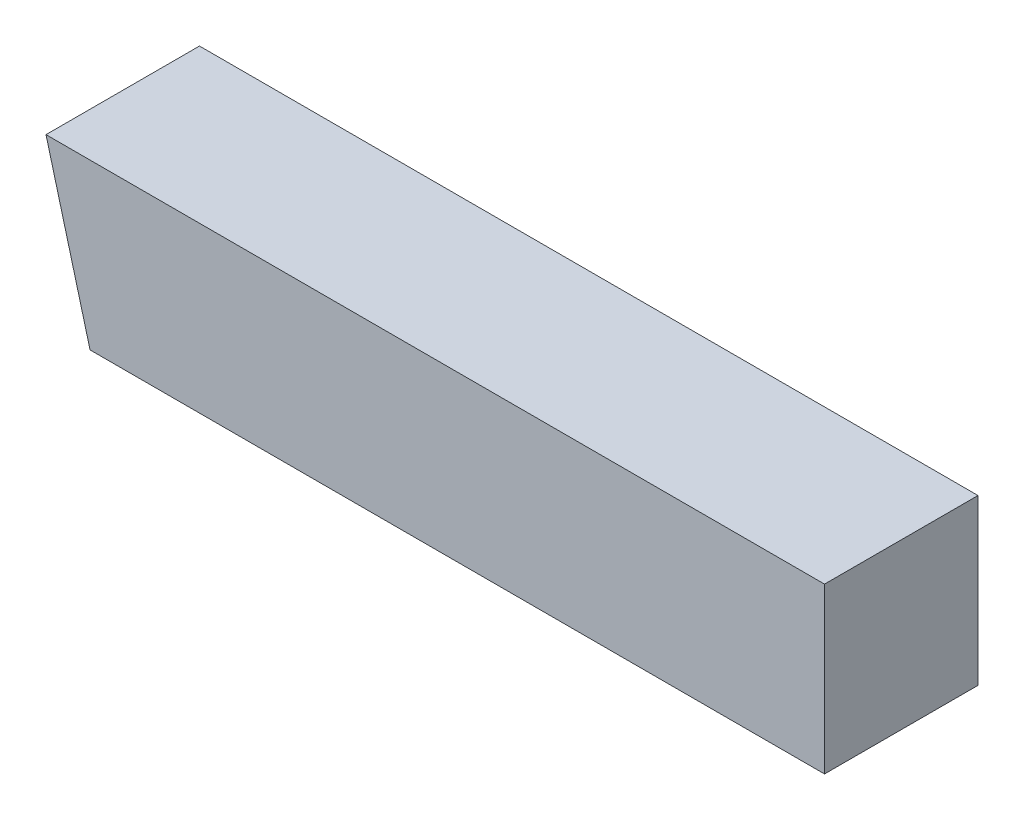
ISO-10303-21;
HEADER;
FILE_DESCRIPTION(('STEP AP214'),'2;1');
FILE_NAME('part.step','',(''),(''),'','','');
FILE_SCHEMA(('AUTOMOTIVE_DESIGN { 1 0 10303 214 1 1 1 1 }'));
ENDSEC;
DATA;
#1=APPLICATION_CONTEXT('core data for automotive mechanical design processes');
#2=APPLICATION_PROTOCOL_DEFINITION('international standard','automotive_design',2000,#1);
#3=PRODUCT_CONTEXT('',#1,'mechanical');
#4=PRODUCT('Part','Part','',(#3));
#5=PRODUCT_RELATED_PRODUCT_CATEGORY('part','',(#4));
#6=PRODUCT_DEFINITION_FORMATION('','',#4);
#7=PRODUCT_DEFINITION_CONTEXT('part definition',#1,'design');
#8=PRODUCT_DEFINITION('design','',#6,#7);
#9=PRODUCT_DEFINITION_SHAPE('','',#8);
#10=(LENGTH_UNIT() NAMED_UNIT(*) SI_UNIT(.MILLI.,.METRE.));
#11=(NAMED_UNIT(*) PLANE_ANGLE_UNIT() SI_UNIT($,.RADIAN.));
#12=(NAMED_UNIT(*) SI_UNIT($,.STERADIAN.) SOLID_ANGLE_UNIT());
#13=UNCERTAINTY_MEASURE_WITH_UNIT(LENGTH_MEASURE(1.E-05),#10,'distance_accuracy_value','');
#14=(GEOMETRIC_REPRESENTATION_CONTEXT(3) GLOBAL_UNCERTAINTY_ASSIGNED_CONTEXT((#13)) GLOBAL_UNIT_ASSIGNED_CONTEXT((#10,
#11,#12)) REPRESENTATION_CONTEXT('',''));
#15=CARTESIAN_POINT('',(0.,0.,0.));
#16=DIRECTION('',(0.,0.,1.));
#17=DIRECTION('',(1.,0.,0.));
#18=AXIS2_PLACEMENT_3D('',#15,#16,#17);
#19=CARTESIAN_POINT('',(0.,38.1,35.56));
#20=DIRECTION('',(-1.,0.,0.));
#21=DIRECTION('',(0.,-1.,0.));
#22=AXIS2_PLACEMENT_3D('',#19,#20,#21);
#23=PLANE('',#22);
#24=DIRECTION('',(0.,1.,0.));
#25=VECTOR('',#24,1.);
#26=CARTESIAN_POINT('',(0.,38.1,0.));
#27=LINE('',#26,#25);
#28=CARTESIAN_POINT('',(0.,0.,0.));
#29=VERTEX_POINT('',#28);
#30=CARTESIAN_POINT('',(0.,38.1,0.));
#31=VERTEX_POINT('',#30);
#32=EDGE_CURVE('E102',#29,#31,#27,.T.);
#33=ORIENTED_EDGE('',*,*,#32,.T.);
#34=DIRECTION('',(0.,0.,-1.));
#35=VECTOR('',#34,1.);
#36=CARTESIAN_POINT('',(0.,38.1,35.56));
#37=LINE('',#36,#35);
#38=CARTESIAN_POINT('',(0.,38.1,35.56));
#39=VERTEX_POINT('',#38);
#40=EDGE_CURVE('E11',#39,#31,#37,.T.);
#41=ORIENTED_EDGE('',*,*,#40,.F.);
#42=DIRECTION('',(0.,1.,0.));
#43=VECTOR('',#42,1.);
#44=CARTESIAN_POINT('',(0.,38.1,35.56));
#45=LINE('',#44,#43);
#46=CARTESIAN_POINT('',(0.,0.,35.56));
#47=VERTEX_POINT('',#46);
#48=EDGE_CURVE('E90',#47,#39,#45,.T.);
#49=ORIENTED_EDGE('',*,*,#48,.F.);
#50=DIRECTION('',(0.,0.,-1.));
#51=VECTOR('',#50,1.);
#52=CARTESIAN_POINT('',(0.,0.,35.56));
#53=LINE('',#52,#51);
#54=EDGE_CURVE('E98',#47,#29,#53,.T.);
#55=ORIENTED_EDGE('',*,*,#54,.T.);
#56=EDGE_LOOP('',(#33,#41,#49,#55));
#57=FACE_BOUND('',#56,.T.);
#58=ADVANCED_FACE('F39',(#57),#23,.F.);
#59=CARTESIAN_POINT('',(-180.388864231626,38.1,35.56));
#60=DIRECTION('',(0.,-1.,0.));
#61=DIRECTION('',(0.,0.,-1.));
#62=AXIS2_PLACEMENT_3D('',#59,#60,#61);
#63=PLANE('',#62);
#64=DIRECTION('',(-1.,0.,0.));
#65=VECTOR('',#64,1.);
#66=CARTESIAN_POINT('',(-180.388864231626,38.1,0.));
#67=LINE('',#66,#65);
#68=CARTESIAN_POINT('',(-180.388864231626,38.1,0.));
#69=VERTEX_POINT('',#68);
#70=EDGE_CURVE('E94',#31,#69,#67,.T.);
#71=ORIENTED_EDGE('',*,*,#70,.T.);
#72=DIRECTION('',(0.,0.,-1.));
#73=VECTOR('',#72,1.);
#74=CARTESIAN_POINT('',(-180.388864231626,38.1,35.56));
#75=LINE('',#74,#73);
#76=CARTESIAN_POINT('',(-180.388864231626,38.1,35.56));
#77=VERTEX_POINT('',#76);
#78=EDGE_CURVE('E47',#77,#69,#75,.T.);
#79=ORIENTED_EDGE('',*,*,#78,.F.);
#80=DIRECTION('',(-1.,0.,0.));
#81=VECTOR('',#80,1.);
#82=CARTESIAN_POINT('',(-180.388864231626,38.1,35.56));
#83=LINE('',#82,#81);
#84=EDGE_CURVE('E85',#39,#77,#83,.T.);
#85=ORIENTED_EDGE('',*,*,#84,.F.);
#86=ORIENTED_EDGE('',*,*,#40,.T.);
#87=EDGE_LOOP('',(#71,#79,#85,#86));
#88=FACE_BOUND('',#87,.T.);
#89=ADVANCED_FACE('F93',(#88),#63,.F.);
#90=CARTESIAN_POINT('',(-170.18,0.,35.56));
#91=DIRECTION('',(0.965925826289069,0.258819045102518,0.));
#92=DIRECTION('',(-0.258819045102518,0.965925826289069,0.));
#93=AXIS2_PLACEMENT_3D('',#90,#91,#92);
#94=PLANE('',#93);
#95=DIRECTION('',(0.258819045102518,-0.965925826289069,0.));
#96=VECTOR('',#95,1.);
#97=CARTESIAN_POINT('',(-170.18,0.,0.));
#98=LINE('',#97,#96);
#99=CARTESIAN_POINT('',(-170.18,0.,0.));
#100=VERTEX_POINT('',#99);
#101=EDGE_CURVE('E72',#69,#100,#98,.T.);
#102=ORIENTED_EDGE('',*,*,#101,.T.);
#103=DIRECTION('',(0.,0.,-1.));
#104=VECTOR('',#103,1.);
#105=CARTESIAN_POINT('',(-170.18,0.,35.56));
#106=LINE('',#105,#104);
#107=CARTESIAN_POINT('',(-170.18,0.,35.56));
#108=VERTEX_POINT('',#107);
#109=EDGE_CURVE('E95',#108,#100,#106,.T.);
#110=ORIENTED_EDGE('',*,*,#109,.F.);
#111=DIRECTION('',(0.258819045102518,-0.965925826289069,0.));
#112=VECTOR('',#111,1.);
#113=CARTESIAN_POINT('',(-170.18,0.,35.56));
#114=LINE('',#113,#112);
#115=EDGE_CURVE('E88',#77,#108,#114,.T.);
#116=ORIENTED_EDGE('',*,*,#115,.F.);
#117=ORIENTED_EDGE('',*,*,#78,.T.);
#118=EDGE_LOOP('',(#102,#110,#116,#117));
#119=FACE_BOUND('',#118,.T.);
#120=ADVANCED_FACE('F96',(#119),#94,.F.);
#121=CARTESIAN_POINT('',(0.,0.,35.56));
#122=DIRECTION('',(0.,1.,0.));
#123=DIRECTION('',(-1.,0.,0.));
#124=AXIS2_PLACEMENT_3D('',#121,#122,#123);
#125=PLANE('',#124);
#126=DIRECTION('',(1.,0.,0.));
#127=VECTOR('',#126,1.);
#128=CARTESIAN_POINT('',(0.,0.,0.));
#129=LINE('',#128,#127);
#130=EDGE_CURVE('E78',#100,#29,#129,.T.);
#131=ORIENTED_EDGE('',*,*,#130,.T.);
#132=ORIENTED_EDGE('',*,*,#54,.F.);
#133=DIRECTION('',(1.,0.,0.));
#134=VECTOR('',#133,1.);
#135=CARTESIAN_POINT('',(0.,0.,35.56));
#136=LINE('',#135,#134);
#137=EDGE_CURVE('E55',#108,#47,#136,.T.);
#138=ORIENTED_EDGE('',*,*,#137,.F.);
#139=ORIENTED_EDGE('',*,*,#109,.T.);
#140=EDGE_LOOP('',(#131,#132,#138,#139));
#141=FACE_BOUND('',#140,.T.);
#142=ADVANCED_FACE('F109',(#141),#125,.F.);
#143=CARTESIAN_POINT('',(0.,0.,35.56));
#144=DIRECTION('',(0.,0.,-1.));
#145=DIRECTION('',(-1.,0.,0.));
#146=AXIS2_PLACEMENT_3D('',#143,#144,#145);
#147=PLANE('',#146);
#148=ORIENTED_EDGE('',*,*,#48,.T.);
#149=ORIENTED_EDGE('',*,*,#84,.T.);
#150=ORIENTED_EDGE('',*,*,#115,.T.);
#151=ORIENTED_EDGE('',*,*,#137,.T.);
#152=EDGE_LOOP('',(#148,#149,#150,#151));
#153=FACE_BOUND('',#152,.T.);
#154=ADVANCED_FACE('F86',(#153),#147,.F.);
#155=CARTESIAN_POINT('',(0.,0.,0.));
#156=DIRECTION('',(0.,0.,-1.));
#157=DIRECTION('',(-1.,0.,0.));
#158=AXIS2_PLACEMENT_3D('',#155,#156,#157);
#159=PLANE('',#158);
#160=ORIENTED_EDGE('',*,*,#32,.F.);
#161=ORIENTED_EDGE('',*,*,#130,.F.);
#162=ORIENTED_EDGE('',*,*,#101,.F.);
#163=ORIENTED_EDGE('',*,*,#70,.F.);
#164=EDGE_LOOP('',(#160,#161,#162,#163));
#165=FACE_BOUND('',#164,.T.);
#166=ADVANCED_FACE('F112',(#165),#159,.T.);
#167=CLOSED_SHELL('',(#58,#89,#120,#142,#154,#166));
#168=MANIFOLD_SOLID_BREP('B2',#167);
#169=ADVANCED_BREP_SHAPE_REPRESENTATION('',(#18,#168),#14);
#170=SHAPE_DEFINITION_REPRESENTATION(#9,#169);
ENDSEC;
END-ISO-10303-21;
